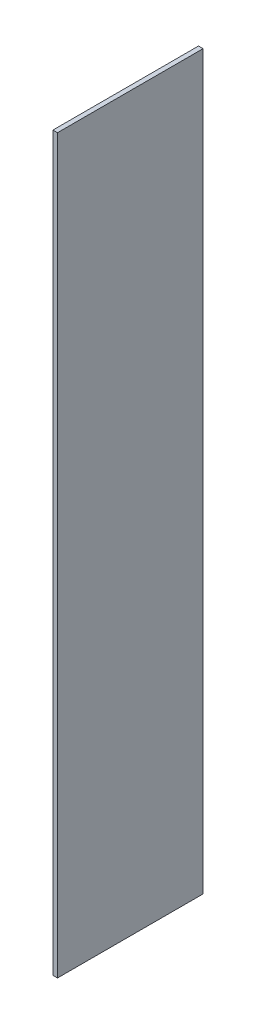
ISO-10303-21;
HEADER;
FILE_DESCRIPTION(('STEP AP214'),'2;1');
FILE_NAME('part.step','',(''),(''),'','','');
FILE_SCHEMA(('AUTOMOTIVE_DESIGN { 1 0 10303 214 1 1 1 1 }'));
ENDSEC;
DATA;
#1=APPLICATION_CONTEXT('core data for automotive mechanical design processes');
#2=APPLICATION_PROTOCOL_DEFINITION('international standard','automotive_design',2000,#1);
#3=PRODUCT_CONTEXT('',#1,'mechanical');
#4=PRODUCT('Part','Part','',(#3));
#5=PRODUCT_RELATED_PRODUCT_CATEGORY('part','',(#4));
#6=PRODUCT_DEFINITION_FORMATION('','',#4);
#7=PRODUCT_DEFINITION_CONTEXT('part definition',#1,'design');
#8=PRODUCT_DEFINITION('design','',#6,#7);
#9=PRODUCT_DEFINITION_SHAPE('','',#8);
#10=(LENGTH_UNIT() NAMED_UNIT(*) SI_UNIT(.MILLI.,.METRE.));
#11=(NAMED_UNIT(*) PLANE_ANGLE_UNIT() SI_UNIT($,.RADIAN.));
#12=(NAMED_UNIT(*) SI_UNIT($,.STERADIAN.) SOLID_ANGLE_UNIT());
#13=UNCERTAINTY_MEASURE_WITH_UNIT(LENGTH_MEASURE(1.E-05),#10,'distance_accuracy_value','');
#14=(GEOMETRIC_REPRESENTATION_CONTEXT(3) GLOBAL_UNCERTAINTY_ASSIGNED_CONTEXT((#13)) GLOBAL_UNIT_ASSIGNED_CONTEXT((#10,
#11,#12)) REPRESENTATION_CONTEXT('',''));
#15=CARTESIAN_POINT('',(0.,0.,0.));
#16=DIRECTION('',(0.,0.,1.));
#17=DIRECTION('',(1.,0.,0.));
#18=AXIS2_PLACEMENT_3D('',#15,#16,#17);
#19=CARTESIAN_POINT('',(-0.55,88.,0.));
#20=DIRECTION('',(0.,0.,-1.));
#21=DIRECTION('',(-1.,0.,0.));
#22=AXIS2_PLACEMENT_3D('',#19,#20,#21);
#23=PLANE('',#22);
#24=DIRECTION('',(1.,0.,0.));
#25=VECTOR('',#24,1.);
#26=CARTESIAN_POINT('',(-0.55,0.,0.));
#27=LINE('',#26,#25);
#28=CARTESIAN_POINT('',(-0.55,0.,0.));
#29=VERTEX_POINT('',#28);
#30=CARTESIAN_POINT('',(0.,0.,0.));
#31=VERTEX_POINT('',#30);
#32=EDGE_CURVE('E100',#29,#31,#27,.T.);
#33=ORIENTED_EDGE('',*,*,#32,.T.);
#34=DIRECTION('',(0.,-1.,0.));
#35=VECTOR('',#34,1.);
#36=CARTESIAN_POINT('',(0.,88.,0.));
#37=LINE('',#36,#35);
#38=CARTESIAN_POINT('',(0.,88.,0.));
#39=VERTEX_POINT('',#38);
#40=EDGE_CURVE('E11',#39,#31,#37,.T.);
#41=ORIENTED_EDGE('',*,*,#40,.F.);
#42=DIRECTION('',(1.,0.,0.));
#43=VECTOR('',#42,1.);
#44=CARTESIAN_POINT('',(-0.55,88.,0.));
#45=LINE('',#44,#43);
#46=CARTESIAN_POINT('',(-0.55,88.,0.));
#47=VERTEX_POINT('',#46);
#48=EDGE_CURVE('E88',#47,#39,#45,.T.);
#49=ORIENTED_EDGE('',*,*,#48,.F.);
#50=DIRECTION('',(0.,-1.,0.));
#51=VECTOR('',#50,1.);
#52=CARTESIAN_POINT('',(-0.55,88.,0.));
#53=LINE('',#52,#51);
#54=EDGE_CURVE('E96',#47,#29,#53,.T.);
#55=ORIENTED_EDGE('',*,*,#54,.T.);
#56=EDGE_LOOP('',(#33,#41,#49,#55));
#57=FACE_BOUND('',#56,.T.);
#58=ADVANCED_FACE('F37',(#57),#23,.F.);
#59=CARTESIAN_POINT('',(0.,88.,0.));
#60=DIRECTION('',(-1.,0.,0.));
#61=DIRECTION('',(0.,0.,1.));
#62=AXIS2_PLACEMENT_3D('',#59,#60,#61);
#63=PLANE('',#62);
#64=DIRECTION('',(0.,0.,-1.));
#65=VECTOR('',#64,1.);
#66=CARTESIAN_POINT('',(0.,0.,0.));
#67=LINE('',#66,#65);
#68=CARTESIAN_POINT('',(0.,0.,-17.5));
#69=VERTEX_POINT('',#68);
#70=EDGE_CURVE('E92',#31,#69,#67,.T.);
#71=ORIENTED_EDGE('',*,*,#70,.T.);
#72=DIRECTION('',(0.,-1.,0.));
#73=VECTOR('',#72,1.);
#74=CARTESIAN_POINT('',(0.,88.,-17.5));
#75=LINE('',#74,#73);
#76=CARTESIAN_POINT('',(0.,88.,-17.5));
#77=VERTEX_POINT('',#76);
#78=EDGE_CURVE('E45',#77,#69,#75,.T.);
#79=ORIENTED_EDGE('',*,*,#78,.F.);
#80=DIRECTION('',(0.,0.,-1.));
#81=VECTOR('',#80,1.);
#82=CARTESIAN_POINT('',(0.,88.,0.));
#83=LINE('',#82,#81);
#84=EDGE_CURVE('E83',#39,#77,#83,.T.);
#85=ORIENTED_EDGE('',*,*,#84,.F.);
#86=ORIENTED_EDGE('',*,*,#40,.T.);
#87=EDGE_LOOP('',(#71,#79,#85,#86));
#88=FACE_BOUND('',#87,.T.);
#89=ADVANCED_FACE('F91',(#88),#63,.F.);
#90=CARTESIAN_POINT('',(0.,88.,-17.5));
#91=DIRECTION('',(0.,0.,1.));
#92=DIRECTION('',(1.,0.,0.));
#93=AXIS2_PLACEMENT_3D('',#90,#91,#92);
#94=PLANE('',#93);
#95=DIRECTION('',(-1.,0.,0.));
#96=VECTOR('',#95,1.);
#97=CARTESIAN_POINT('',(0.,0.,-17.5));
#98=LINE('',#97,#96);
#99=CARTESIAN_POINT('',(-0.55,0.,-17.5));
#100=VERTEX_POINT('',#99);
#101=EDGE_CURVE('E70',#69,#100,#98,.T.);
#102=ORIENTED_EDGE('',*,*,#101,.T.);
#103=DIRECTION('',(0.,-1.,0.));
#104=VECTOR('',#103,1.);
#105=CARTESIAN_POINT('',(-0.55,88.,-17.5));
#106=LINE('',#105,#104);
#107=CARTESIAN_POINT('',(-0.55,88.,-17.5));
#108=VERTEX_POINT('',#107);
#109=EDGE_CURVE('E93',#108,#100,#106,.T.);
#110=ORIENTED_EDGE('',*,*,#109,.F.);
#111=DIRECTION('',(-1.,0.,0.));
#112=VECTOR('',#111,1.);
#113=CARTESIAN_POINT('',(0.,88.,-17.5));
#114=LINE('',#113,#112);
#115=EDGE_CURVE('E86',#77,#108,#114,.T.);
#116=ORIENTED_EDGE('',*,*,#115,.F.);
#117=ORIENTED_EDGE('',*,*,#78,.T.);
#118=EDGE_LOOP('',(#102,#110,#116,#117));
#119=FACE_BOUND('',#118,.T.);
#120=ADVANCED_FACE('F94',(#119),#94,.F.);
#121=CARTESIAN_POINT('',(-0.55,88.,-17.5));
#122=DIRECTION('',(1.,0.,0.));
#123=DIRECTION('',(0.,0.,-1.));
#124=AXIS2_PLACEMENT_3D('',#121,#122,#123);
#125=PLANE('',#124);
#126=DIRECTION('',(0.,0.,1.));
#127=VECTOR('',#126,1.);
#128=CARTESIAN_POINT('',(-0.55,0.,-17.5));
#129=LINE('',#128,#127);
#130=EDGE_CURVE('E76',#100,#29,#129,.T.);
#131=ORIENTED_EDGE('',*,*,#130,.T.);
#132=ORIENTED_EDGE('',*,*,#54,.F.);
#133=DIRECTION('',(0.,0.,1.));
#134=VECTOR('',#133,1.);
#135=CARTESIAN_POINT('',(-0.55,88.,-17.5));
#136=LINE('',#135,#134);
#137=EDGE_CURVE('E53',#108,#47,#136,.T.);
#138=ORIENTED_EDGE('',*,*,#137,.F.);
#139=ORIENTED_EDGE('',*,*,#109,.T.);
#140=EDGE_LOOP('',(#131,#132,#138,#139));
#141=FACE_BOUND('',#140,.T.);
#142=ADVANCED_FACE('F107',(#141),#125,.F.);
#143=CARTESIAN_POINT('',(0.,88.,0.));
#144=DIRECTION('',(0.,1.,0.));
#145=DIRECTION('',(0.,0.,1.));
#146=AXIS2_PLACEMENT_3D('',#143,#144,#145);
#147=PLANE('',#146);
#148=ORIENTED_EDGE('',*,*,#48,.T.);
#149=ORIENTED_EDGE('',*,*,#84,.T.);
#150=ORIENTED_EDGE('',*,*,#115,.T.);
#151=ORIENTED_EDGE('',*,*,#137,.T.);
#152=EDGE_LOOP('',(#148,#149,#150,#151));
#153=FACE_BOUND('',#152,.T.);
#154=ADVANCED_FACE('F84',(#153),#147,.T.);
#155=CARTESIAN_POINT('',(0.,0.,0.));
#156=DIRECTION('',(0.,1.,0.));
#157=DIRECTION('',(0.,0.,1.));
#158=AXIS2_PLACEMENT_3D('',#155,#156,#157);
#159=PLANE('',#158);
#160=ORIENTED_EDGE('',*,*,#32,.F.);
#161=ORIENTED_EDGE('',*,*,#130,.F.);
#162=ORIENTED_EDGE('',*,*,#101,.F.);
#163=ORIENTED_EDGE('',*,*,#70,.F.);
#164=EDGE_LOOP('',(#160,#161,#162,#163));
#165=FACE_BOUND('',#164,.T.);
#166=ADVANCED_FACE('F110',(#165),#159,.F.);
#167=CLOSED_SHELL('',(#58,#89,#120,#142,#154,#166));
#168=MANIFOLD_SOLID_BREP('B2',#167);
#169=ADVANCED_BREP_SHAPE_REPRESENTATION('',(#18,#168),#14);
#170=SHAPE_DEFINITION_REPRESENTATION(#9,#169);
ENDSEC;
END-ISO-10303-21;
